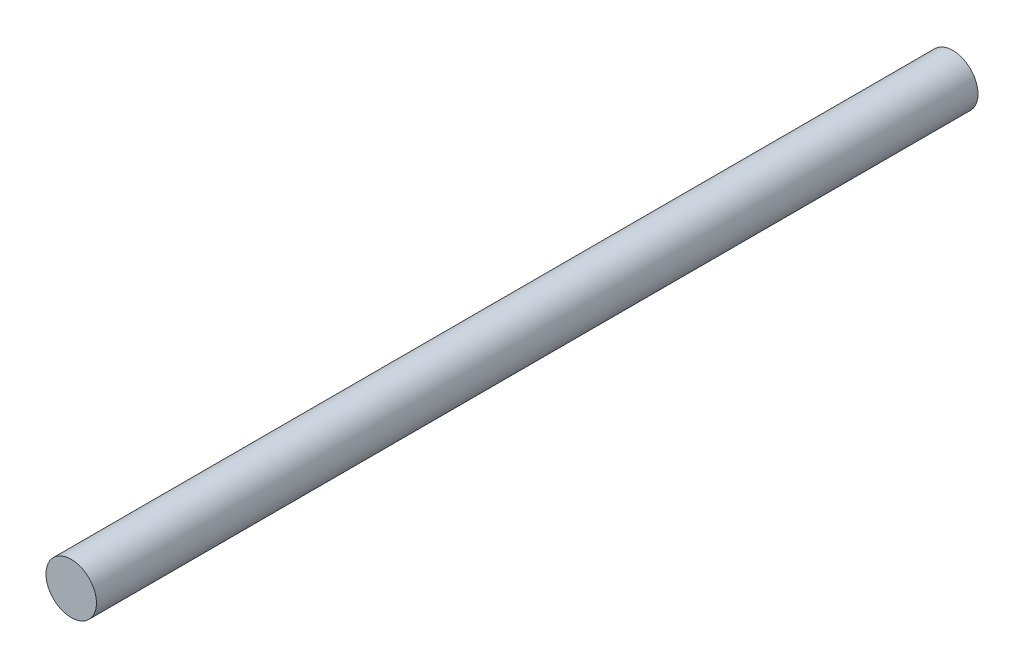
ISO-10303-21;
HEADER;
FILE_DESCRIPTION(('STEP AP214'),'2;1');
FILE_NAME('part.step','',(''),(''),'','','');
FILE_SCHEMA(('AUTOMOTIVE_DESIGN { 1 0 10303 214 1 1 1 1 }'));
ENDSEC;
DATA;
#1=APPLICATION_CONTEXT('core data for automotive mechanical design processes');
#2=APPLICATION_PROTOCOL_DEFINITION('international standard','automotive_design',2000,#1);
#3=PRODUCT_CONTEXT('',#1,'mechanical');
#4=PRODUCT('Part','Part','',(#3));
#5=PRODUCT_RELATED_PRODUCT_CATEGORY('part','',(#4));
#6=PRODUCT_DEFINITION_FORMATION('','',#4);
#7=PRODUCT_DEFINITION_CONTEXT('part definition',#1,'design');
#8=PRODUCT_DEFINITION('design','',#6,#7);
#9=PRODUCT_DEFINITION_SHAPE('','',#8);
#10=(LENGTH_UNIT() NAMED_UNIT(*) SI_UNIT(.MILLI.,.METRE.));
#11=(NAMED_UNIT(*) PLANE_ANGLE_UNIT() SI_UNIT($,.RADIAN.));
#12=(NAMED_UNIT(*) SI_UNIT($,.STERADIAN.) SOLID_ANGLE_UNIT());
#13=UNCERTAINTY_MEASURE_WITH_UNIT(LENGTH_MEASURE(1.E-05),#10,'distance_accuracy_value','');
#14=(GEOMETRIC_REPRESENTATION_CONTEXT(3) GLOBAL_UNCERTAINTY_ASSIGNED_CONTEXT((#13)) GLOBAL_UNIT_ASSIGNED_CONTEXT((#10,
#11,#12)) REPRESENTATION_CONTEXT('',''));
#15=CARTESIAN_POINT('',(0.,0.,0.));
#16=DIRECTION('',(0.,0.,1.));
#17=DIRECTION('',(1.,0.,0.));
#18=AXIS2_PLACEMENT_3D('',#15,#16,#17);
#19=CARTESIAN_POINT('',(0.,0.,139.7));
#20=DIRECTION('',(0.,0.,-1.));
#21=DIRECTION('',(-1.,0.,0.));
#22=AXIS2_PLACEMENT_3D('',#19,#20,#21);
#23=CYLINDRICAL_SURFACE('',#22,4.);
#24=CARTESIAN_POINT('',(0.,0.,139.7));
#25=DIRECTION('',(0.,0.,1.));
#26=DIRECTION('',(1.,0.,0.));
#27=AXIS2_PLACEMENT_3D('',#24,#25,#26);
#28=CIRCLE('',#27,4.);
#29=CARTESIAN_POINT('',(4.,0.,139.7));
#30=VERTEX_POINT('',#29);
#31=EDGE_CURVE('E10',#30,#30,#28,.T.);
#32=ORIENTED_EDGE('',*,*,#31,.F.);
#33=EDGE_LOOP('',(#32));
#34=FACE_BOUND('',#33,.T.);
#35=CARTESIAN_POINT('',(0.,0.,0.));
#36=DIRECTION('',(0.,0.,1.));
#37=DIRECTION('',(1.,0.,0.));
#38=AXIS2_PLACEMENT_3D('',#35,#36,#37);
#39=CIRCLE('',#38,4.);
#40=CARTESIAN_POINT('',(4.,0.,0.));
#41=VERTEX_POINT('',#40);
#42=EDGE_CURVE('E34',#41,#41,#39,.T.);
#43=ORIENTED_EDGE('',*,*,#42,.T.);
#44=EDGE_LOOP('',(#43));
#45=FACE_BOUND('',#44,.T.);
#46=ADVANCED_FACE('F31',(#34,#45),#23,.T.);
#47=CARTESIAN_POINT('',(0.,0.,139.7));
#48=DIRECTION('',(0.,0.,1.));
#49=DIRECTION('',(1.,0.,0.));
#50=AXIS2_PLACEMENT_3D('',#47,#48,#49);
#51=PLANE('',#50);
#52=ORIENTED_EDGE('',*,*,#31,.T.);
#53=EDGE_LOOP('',(#52));
#54=FACE_BOUND('',#53,.T.);
#55=ADVANCED_FACE('F46',(#54),#51,.T.);
#56=CARTESIAN_POINT('',(0.,0.,0.));
#57=DIRECTION('',(0.,0.,1.));
#58=DIRECTION('',(1.,0.,0.));
#59=AXIS2_PLACEMENT_3D('',#56,#57,#58);
#60=PLANE('',#59);
#61=ORIENTED_EDGE('',*,*,#42,.F.);
#62=EDGE_LOOP('',(#61));
#63=FACE_BOUND('',#62,.T.);
#64=ADVANCED_FACE('F44',(#63),#60,.F.);
#65=CLOSED_SHELL('',(#46,#55,#64));
#66=MANIFOLD_SOLID_BREP('B2',#65);
#67=ADVANCED_BREP_SHAPE_REPRESENTATION('',(#18,#66),#14);
#68=SHAPE_DEFINITION_REPRESENTATION(#9,#67);
ENDSEC;
END-ISO-10303-21;
